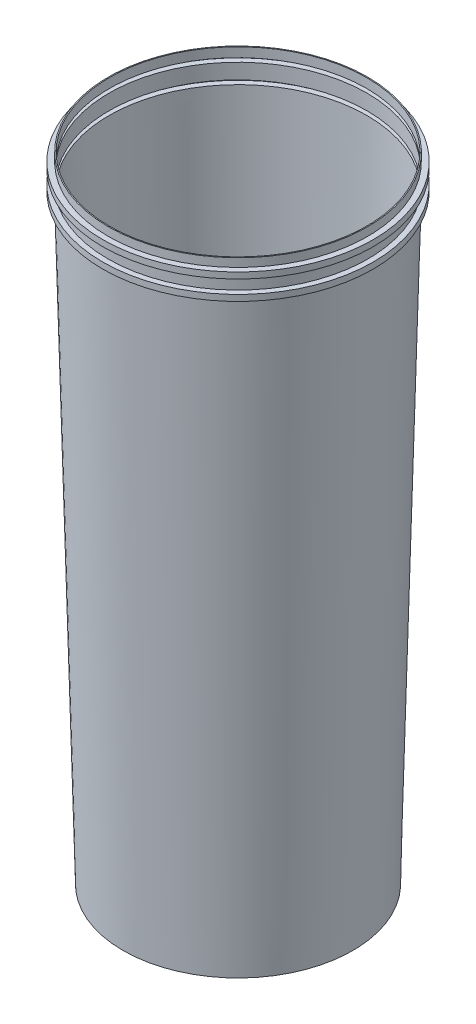
ISO-10303-21;
HEADER;
FILE_DESCRIPTION(('STEP AP214'),'2;1');
FILE_NAME('part.step','',(''),(''),'','','');
FILE_SCHEMA(('AUTOMOTIVE_DESIGN { 1 0 10303 214 1 1 1 1 }'));
ENDSEC;
DATA;
#1=APPLICATION_CONTEXT('core data for automotive mechanical design processes');
#2=APPLICATION_PROTOCOL_DEFINITION('international standard','automotive_design',2000,#1);
#3=PRODUCT_CONTEXT('',#1,'mechanical');
#4=PRODUCT('Part','Part','',(#3));
#5=PRODUCT_RELATED_PRODUCT_CATEGORY('part','',(#4));
#6=PRODUCT_DEFINITION_FORMATION('','',#4);
#7=PRODUCT_DEFINITION_CONTEXT('part definition',#1,'design');
#8=PRODUCT_DEFINITION('design','',#6,#7);
#9=PRODUCT_DEFINITION_SHAPE('','',#8);
#10=(LENGTH_UNIT() NAMED_UNIT(*) SI_UNIT(.MILLI.,.METRE.));
#11=(NAMED_UNIT(*) PLANE_ANGLE_UNIT() SI_UNIT($,.RADIAN.));
#12=(NAMED_UNIT(*) SI_UNIT($,.STERADIAN.) SOLID_ANGLE_UNIT());
#13=UNCERTAINTY_MEASURE_WITH_UNIT(LENGTH_MEASURE(1.E-05),#10,'distance_accuracy_value','');
#14=(GEOMETRIC_REPRESENTATION_CONTEXT(3) GLOBAL_UNCERTAINTY_ASSIGNED_CONTEXT((#13)) GLOBAL_UNIT_ASSIGNED_CONTEXT((#10,
#11,#12)) REPRESENTATION_CONTEXT('',''));
#15=CARTESIAN_POINT('',(0.,0.,0.));
#16=DIRECTION('',(0.,0.,1.));
#17=DIRECTION('',(1.,0.,0.));
#18=AXIS2_PLACEMENT_3D('',#15,#16,#17);
#19=CARTESIAN_POINT('',(0.,620.,0.));
#20=DIRECTION('',(0.,-1.,0.));
#21=DIRECTION('',(0.,0.,-1.));
#22=AXIS2_PLACEMENT_3D('',#19,#20,#21);
#23=PLANE('',#22);
#24=CARTESIAN_POINT('',(0.,620.,0.));
#25=DIRECTION('',(0.,-1.,0.));
#26=DIRECTION('',(0.,0.,-1.));
#27=AXIS2_PLACEMENT_3D('',#24,#25,#26);
#28=CIRCLE('',#27,126.);
#29=CARTESIAN_POINT('',(0.,620.,-126.));
#30=VERTEX_POINT('',#29);
#31=EDGE_CURVE('E93',#30,#30,#28,.T.);
#32=ORIENTED_EDGE('',*,*,#31,.T.);
#33=EDGE_LOOP('',(#32));
#34=FACE_BOUND('',#33,.T.);
#35=CARTESIAN_POINT('',(0.,620.,0.));
#36=DIRECTION('',(0.,-1.,0.));
#37=DIRECTION('',(0.,0.,-1.));
#38=AXIS2_PLACEMENT_3D('',#35,#36,#37);
#39=CIRCLE('',#38,127.);
#40=CARTESIAN_POINT('',(0.,620.,-127.));
#41=VERTEX_POINT('',#40);
#42=EDGE_CURVE('E11',#41,#41,#39,.T.);
#43=ORIENTED_EDGE('',*,*,#42,.F.);
#44=EDGE_LOOP('',(#43));
#45=FACE_BOUND('',#44,.T.);
#46=ADVANCED_FACE('F74',(#34,#45),#23,.F.);
#47=CARTESIAN_POINT('',(0.,0.,0.));
#48=DIRECTION('',(0.,-1.,0.));
#49=DIRECTION('',(0.,0.,-1.));
#50=AXIS2_PLACEMENT_3D('',#47,#48,#49);
#51=CYLINDRICAL_SURFACE('',#50,127.);
#52=CARTESIAN_POINT('',(0.,611.763571770545,0.));
#53=DIRECTION('',(0.,-1.,0.));
#54=DIRECTION('',(0.,0.,-1.));
#55=AXIS2_PLACEMENT_3D('',#52,#53,#54);
#56=CIRCLE('',#55,127.);
#57=CARTESIAN_POINT('',(0.,611.763571770545,-127.));
#58=VERTEX_POINT('',#57);
#59=EDGE_CURVE('E81',#58,#58,#56,.T.);
#60=ORIENTED_EDGE('',*,*,#59,.F.);
#61=EDGE_LOOP('',(#60));
#62=FACE_BOUND('',#61,.T.);
#63=ORIENTED_EDGE('',*,*,#42,.T.);
#64=EDGE_LOOP('',(#63));
#65=FACE_BOUND('',#64,.T.);
#66=ADVANCED_FACE('F180',(#62,#65),#51,.T.);
#67=CARTESIAN_POINT('',(-126.,611.763571770545,0.));
#68=DIRECTION('',(0.,-1.,0.));
#69=DIRECTION('',(0.,0.,-1.));
#70=AXIS2_PLACEMENT_3D('',#67,#68,#69);
#71=PLANE('',#70);
#72=CARTESIAN_POINT('',(0.,611.763571770545,0.));
#73=DIRECTION('',(0.,-1.,0.));
#74=DIRECTION('',(0.,0.,-1.));
#75=AXIS2_PLACEMENT_3D('',#72,#73,#74);
#76=CIRCLE('',#75,132.422468228301);
#77=CARTESIAN_POINT('',(0.,611.763571770545,-132.422468228301));
#78=VERTEX_POINT('',#77);
#79=EDGE_CURVE('E85',#78,#78,#76,.T.);
#80=ORIENTED_EDGE('',*,*,#79,.F.);
#81=EDGE_LOOP('',(#80));
#82=FACE_BOUND('',#81,.T.);
#83=ORIENTED_EDGE('',*,*,#59,.T.);
#84=EDGE_LOOP('',(#83));
#85=FACE_BOUND('',#84,.T.);
#86=ADVANCED_FACE('F185',(#82,#85),#71,.F.);
#87=CARTESIAN_POINT('',(0.,0.,0.));
#88=DIRECTION('',(0.,-1.,0.));
#89=DIRECTION('',(0.,0.,-1.));
#90=AXIS2_PLACEMENT_3D('',#87,#88,#89);
#91=CYLINDRICAL_SURFACE('',#90,132.422468228301);
#92=CARTESIAN_POINT('',(0.,605.763571770545,0.));
#93=DIRECTION('',(0.,1.,0.));
#94=DIRECTION('',(0.,0.,1.));
#95=AXIS2_PLACEMENT_3D('',#92,#93,#94);
#96=CIRCLE('',#95,132.422468228301);
#97=CARTESIAN_POINT('',(0.,605.763571770545,132.422468228301));
#98=VERTEX_POINT('',#97);
#99=EDGE_CURVE('E90',#98,#98,#96,.F.);
#100=ORIENTED_EDGE('',*,*,#99,.F.);
#101=EDGE_LOOP('',(#100));
#102=FACE_BOUND('',#101,.T.);
#103=ORIENTED_EDGE('',*,*,#79,.T.);
#104=EDGE_LOOP('',(#103));
#105=FACE_BOUND('',#104,.T.);
#106=ADVANCED_FACE('F195',(#102,#105),#91,.T.);
#107=CARTESIAN_POINT('',(-131.422468228301,605.763571770545,0.));
#108=DIRECTION('',(0.,1.,0.));
#109=DIRECTION('',(0.,0.,1.));
#110=AXIS2_PLACEMENT_3D('',#107,#108,#109);
#111=PLANE('',#110);
#112=CARTESIAN_POINT('',(0.,605.763571770545,0.));
#113=DIRECTION('',(0.,1.,0.));
#114=DIRECTION('',(0.,0.,1.));
#115=AXIS2_PLACEMENT_3D('',#112,#113,#114);
#116=CIRCLE('',#115,127.257555315517);
#117=CARTESIAN_POINT('',(0.,605.763571770545,127.257555315517));
#118=VERTEX_POINT('',#117);
#119=EDGE_CURVE('E98',#118,#118,#116,.F.);
#120=ORIENTED_EDGE('',*,*,#119,.F.);
#121=EDGE_LOOP('',(#120));
#122=FACE_BOUND('',#121,.T.);
#123=ORIENTED_EDGE('',*,*,#99,.T.);
#124=EDGE_LOOP('',(#123));
#125=FACE_BOUND('',#124,.T.);
#126=ADVANCED_FACE('F199',(#122,#125),#111,.F.);
#127=CARTESIAN_POINT('',(0.,0.,0.));
#128=DIRECTION('',(0.,-1.,0.));
#129=DIRECTION('',(0.,0.,-1.));
#130=AXIS2_PLACEMENT_3D('',#127,#128,#129);
#131=CYLINDRICAL_SURFACE('',#130,127.257555315517);
#132=CARTESIAN_POINT('',(0.,592.763571770545,0.));
#133=DIRECTION('',(0.,-1.,0.));
#134=DIRECTION('',(0.,0.,-1.));
#135=AXIS2_PLACEMENT_3D('',#132,#133,#134);
#136=CIRCLE('',#135,127.257555315517);
#137=CARTESIAN_POINT('',(0.,592.763571770545,-127.257555315517));
#138=VERTEX_POINT('',#137);
#139=EDGE_CURVE('E101',#138,#138,#136,.T.);
#140=ORIENTED_EDGE('',*,*,#139,.F.);
#141=EDGE_LOOP('',(#140));
#142=FACE_BOUND('',#141,.T.);
#143=ORIENTED_EDGE('',*,*,#119,.T.);
#144=EDGE_LOOP('',(#143));
#145=FACE_BOUND('',#144,.T.);
#146=ADVANCED_FACE('F203',(#142,#145),#131,.T.);
#147=CARTESIAN_POINT('',(-126.257555315517,592.763571770545,0.));
#148=DIRECTION('',(0.,-1.,0.));
#149=DIRECTION('',(0.,0.,-1.));
#150=AXIS2_PLACEMENT_3D('',#147,#148,#149);
#151=PLANE('',#150);
#152=CARTESIAN_POINT('',(0.,592.763571770545,0.));
#153=DIRECTION('',(0.,-1.,0.));
#154=DIRECTION('',(0.,0.,-1.));
#155=AXIS2_PLACEMENT_3D('',#152,#153,#154);
#156=CIRCLE('',#155,132.422468228301);
#157=CARTESIAN_POINT('',(0.,592.763571770545,-132.422468228301));
#158=VERTEX_POINT('',#157);
#159=EDGE_CURVE('E104',#158,#158,#156,.T.);
#160=ORIENTED_EDGE('',*,*,#159,.F.);
#161=EDGE_LOOP('',(#160));
#162=FACE_BOUND('',#161,.T.);
#163=ORIENTED_EDGE('',*,*,#139,.T.);
#164=EDGE_LOOP('',(#163));
#165=FACE_BOUND('',#164,.T.);
#166=ADVANCED_FACE('F207',(#162,#165),#151,.F.);
#167=CARTESIAN_POINT('',(0.,0.,0.));
#168=DIRECTION('',(0.,-1.,0.));
#169=DIRECTION('',(0.,0.,-1.));
#170=AXIS2_PLACEMENT_3D('',#167,#168,#169);
#171=CYLINDRICAL_SURFACE('',#170,132.422468228301);
#172=CARTESIAN_POINT('',(0.,586.763571770545,0.));
#173=DIRECTION('',(0.,1.,0.));
#174=DIRECTION('',(0.,0.,1.));
#175=AXIS2_PLACEMENT_3D('',#172,#173,#174);
#176=CIRCLE('',#175,132.422468228301);
#177=CARTESIAN_POINT('',(0.,586.763571770545,132.422468228301));
#178=VERTEX_POINT('',#177);
#179=EDGE_CURVE('E107',#178,#178,#176,.F.);
#180=ORIENTED_EDGE('',*,*,#179,.F.);
#181=EDGE_LOOP('',(#180));
#182=FACE_BOUND('',#181,.T.);
#183=ORIENTED_EDGE('',*,*,#159,.T.);
#184=EDGE_LOOP('',(#183));
#185=FACE_BOUND('',#184,.T.);
#186=ADVANCED_FACE('F211',(#182,#185),#171,.T.);
#187=CARTESIAN_POINT('',(-131.422468228301,586.763571770545,0.));
#188=DIRECTION('',(0.,1.,0.));
#189=DIRECTION('',(0.,0.,1.));
#190=AXIS2_PLACEMENT_3D('',#187,#188,#189);
#191=PLANE('',#190);
#192=CARTESIAN_POINT('',(0.,586.763571770545,0.));
#193=DIRECTION('',(0.,1.,0.));
#194=DIRECTION('',(0.,0.,1.));
#195=AXIS2_PLACEMENT_3D('',#192,#193,#194);
#196=CIRCLE('',#195,127.232944835723);
#197=CARTESIAN_POINT('',(0.,586.763571770545,127.232944835723));
#198=VERTEX_POINT('',#197);
#199=EDGE_CURVE('E110',#198,#198,#196,.F.);
#200=ORIENTED_EDGE('',*,*,#199,.F.);
#201=EDGE_LOOP('',(#200));
#202=FACE_BOUND('',#201,.T.);
#203=ORIENTED_EDGE('',*,*,#179,.T.);
#204=EDGE_LOOP('',(#203));
#205=FACE_BOUND('',#204,.T.);
#206=ADVANCED_FACE('F215',(#202,#205),#191,.F.);
#207=CARTESIAN_POINT('',(0.,587.738658546889,0.));
#208=DIRECTION('',(0.,1.,0.));
#209=DIRECTION('',(0.,0.,1.));
#210=AXIS2_PLACEMENT_3D('',#207,#208,#209);
#211=CONICAL_SURFACE('',#210,127.257244932992,0.0249158015189749);
#212=CARTESIAN_POINT('',(0.,-1.,0.));
#213=DIRECTION('',(0.,1.,0.));
#214=DIRECTION('',(0.,0.,1.));
#215=AXIS2_PLACEMENT_3D('',#212,#213,#214);
#216=CIRCLE('',#215,112.585313146541);
#217=CARTESIAN_POINT('',(0.,-1.,112.585313146541));
#218=VERTEX_POINT('',#217);
#219=EDGE_CURVE('E112',#218,#218,#216,.F.);
#220=ORIENTED_EDGE('',*,*,#219,.F.);
#221=EDGE_LOOP('',(#220));
#222=FACE_BOUND('',#221,.T.);
#223=ORIENTED_EDGE('',*,*,#199,.T.);
#224=EDGE_LOOP('',(#223));
#225=FACE_BOUND('',#224,.T.);
#226=ADVANCED_FACE('F218',(#222,#225),#211,.T.);
#227=CARTESIAN_POINT('',(-111.609923626335,-1.,0.));
#228=DIRECTION('',(0.,1.,0.));
#229=DIRECTION('',(0.,0.,1.));
#230=AXIS2_PLACEMENT_3D('',#227,#228,#229);
#231=PLANE('',#230);
#232=ORIENTED_EDGE('',*,*,#219,.T.);
#233=EDGE_LOOP('',(#232));
#234=FACE_BOUND('',#233,.T.);
#235=ADVANCED_FACE('F76',(#234),#231,.F.);
#236=CARTESIAN_POINT('',(0.,0.,0.));
#237=DIRECTION('',(0.,-1.,0.));
#238=DIRECTION('',(0.,0.,-1.));
#239=AXIS2_PLACEMENT_3D('',#236,#237,#238);
#240=CYLINDRICAL_SURFACE('',#239,126.);
#241=CARTESIAN_POINT('',(0.,610.763571770545,0.));
#242=DIRECTION('',(0.,-1.,0.));
#243=DIRECTION('',(0.,0.,-1.));
#244=AXIS2_PLACEMENT_3D('',#241,#242,#243);
#245=CIRCLE('',#244,126.);
#246=CARTESIAN_POINT('',(0.,610.763571770545,-126.));
#247=VERTEX_POINT('',#246);
#248=EDGE_CURVE('E117',#247,#247,#245,.T.);
#249=ORIENTED_EDGE('',*,*,#248,.T.);
#250=EDGE_LOOP('',(#249));
#251=FACE_BOUND('',#250,.T.);
#252=ORIENTED_EDGE('',*,*,#31,.F.);
#253=EDGE_LOOP('',(#252));
#254=FACE_BOUND('',#253,.T.);
#255=ADVANCED_FACE('F190',(#251,#254),#240,.F.);
#256=CARTESIAN_POINT('',(-126.,610.763571770545,0.));
#257=DIRECTION('',(0.,-1.,0.));
#258=DIRECTION('',(0.,0.,-1.));
#259=AXIS2_PLACEMENT_3D('',#256,#257,#258);
#260=PLANE('',#259);
#261=CARTESIAN_POINT('',(0.,610.763571770545,0.));
#262=DIRECTION('',(0.,-1.,0.));
#263=DIRECTION('',(0.,0.,-1.));
#264=AXIS2_PLACEMENT_3D('',#261,#262,#263);
#265=CIRCLE('',#264,131.422468228301);
#266=CARTESIAN_POINT('',(0.,610.763571770545,-131.422468228301));
#267=VERTEX_POINT('',#266);
#268=EDGE_CURVE('E121',#267,#267,#265,.T.);
#269=ORIENTED_EDGE('',*,*,#268,.T.);
#270=EDGE_LOOP('',(#269));
#271=FACE_BOUND('',#270,.T.);
#272=ORIENTED_EDGE('',*,*,#248,.F.);
#273=EDGE_LOOP('',(#272));
#274=FACE_BOUND('',#273,.T.);
#275=ADVANCED_FACE('F242',(#271,#274),#260,.T.);
#276=CARTESIAN_POINT('',(0.,0.,0.));
#277=DIRECTION('',(0.,-1.,0.));
#278=DIRECTION('',(0.,0.,-1.));
#279=AXIS2_PLACEMENT_3D('',#276,#277,#278);
#280=CYLINDRICAL_SURFACE('',#279,131.422468228301);
#281=CARTESIAN_POINT('',(0.,606.763571770545,0.));
#282=DIRECTION('',(0.,-1.,0.));
#283=DIRECTION('',(0.,0.,-1.));
#284=AXIS2_PLACEMENT_3D('',#281,#282,#283);
#285=CIRCLE('',#284,131.422468228301);
#286=CARTESIAN_POINT('',(0.,606.763571770545,-131.422468228301));
#287=VERTEX_POINT('',#286);
#288=EDGE_CURVE('E125',#287,#287,#285,.T.);
#289=ORIENTED_EDGE('',*,*,#288,.T.);
#290=EDGE_LOOP('',(#289));
#291=FACE_BOUND('',#290,.T.);
#292=ORIENTED_EDGE('',*,*,#268,.F.);
#293=EDGE_LOOP('',(#292));
#294=FACE_BOUND('',#293,.T.);
#295=ADVANCED_FACE('F246',(#291,#294),#280,.F.);
#296=CARTESIAN_POINT('',(-131.422468228301,606.763571770545,0.));
#297=DIRECTION('',(0.,1.,0.));
#298=DIRECTION('',(0.,0.,1.));
#299=AXIS2_PLACEMENT_3D('',#296,#297,#298);
#300=PLANE('',#299);
#301=CARTESIAN_POINT('',(0.,606.763571770545,0.));
#302=DIRECTION('',(0.,-1.,0.));
#303=DIRECTION('',(0.,0.,-1.));
#304=AXIS2_PLACEMENT_3D('',#301,#302,#303);
#305=CIRCLE('',#304,126.257555315517);
#306=CARTESIAN_POINT('',(0.,606.763571770545,-126.257555315517));
#307=VERTEX_POINT('',#306);
#308=EDGE_CURVE('E130',#307,#307,#305,.T.);
#309=ORIENTED_EDGE('',*,*,#308,.T.);
#310=EDGE_LOOP('',(#309));
#311=FACE_BOUND('',#310,.T.);
#312=ORIENTED_EDGE('',*,*,#288,.F.);
#313=EDGE_LOOP('',(#312));
#314=FACE_BOUND('',#313,.T.);
#315=ADVANCED_FACE('F252',(#311,#314),#300,.T.);
#316=CARTESIAN_POINT('',(0.,0.,0.));
#317=DIRECTION('',(0.,-1.,0.));
#318=DIRECTION('',(0.,0.,-1.));
#319=AXIS2_PLACEMENT_3D('',#316,#317,#318);
#320=CYLINDRICAL_SURFACE('',#319,126.257555315517);
#321=CARTESIAN_POINT('',(0.,591.763571770545,0.));
#322=DIRECTION('',(0.,-1.,0.));
#323=DIRECTION('',(0.,0.,-1.));
#324=AXIS2_PLACEMENT_3D('',#321,#322,#323);
#325=CIRCLE('',#324,126.257555315517);
#326=CARTESIAN_POINT('',(0.,591.763571770545,-126.257555315517));
#327=VERTEX_POINT('',#326);
#328=EDGE_CURVE('E133',#327,#327,#325,.T.);
#329=ORIENTED_EDGE('',*,*,#328,.T.);
#330=EDGE_LOOP('',(#329));
#331=FACE_BOUND('',#330,.T.);
#332=ORIENTED_EDGE('',*,*,#308,.F.);
#333=EDGE_LOOP('',(#332));
#334=FACE_BOUND('',#333,.T.);
#335=ADVANCED_FACE('F259',(#331,#334),#320,.F.);
#336=CARTESIAN_POINT('',(-126.257555315517,591.763571770545,0.));
#337=DIRECTION('',(0.,-1.,0.));
#338=DIRECTION('',(0.,0.,-1.));
#339=AXIS2_PLACEMENT_3D('',#336,#337,#338);
#340=PLANE('',#339);
#341=CARTESIAN_POINT('',(0.,591.763571770545,0.));
#342=DIRECTION('',(0.,-1.,0.));
#343=DIRECTION('',(0.,0.,-1.));
#344=AXIS2_PLACEMENT_3D('',#341,#342,#343);
#345=CIRCLE('',#344,131.422468228301);
#346=CARTESIAN_POINT('',(0.,591.763571770545,-131.422468228301));
#347=VERTEX_POINT('',#346);
#348=EDGE_CURVE('E136',#347,#347,#345,.T.);
#349=ORIENTED_EDGE('',*,*,#348,.T.);
#350=EDGE_LOOP('',(#349));
#351=FACE_BOUND('',#350,.T.);
#352=ORIENTED_EDGE('',*,*,#328,.F.);
#353=EDGE_LOOP('',(#352));
#354=FACE_BOUND('',#353,.T.);
#355=ADVANCED_FACE('F263',(#351,#354),#340,.T.);
#356=CARTESIAN_POINT('',(0.,0.,0.));
#357=DIRECTION('',(0.,-1.,0.));
#358=DIRECTION('',(0.,0.,-1.));
#359=AXIS2_PLACEMENT_3D('',#356,#357,#358);
#360=CYLINDRICAL_SURFACE('',#359,131.422468228301);
#361=CARTESIAN_POINT('',(0.,587.763571770545,0.));
#362=DIRECTION('',(0.,-1.,0.));
#363=DIRECTION('',(0.,0.,-1.));
#364=AXIS2_PLACEMENT_3D('',#361,#362,#363);
#365=CIRCLE('',#364,131.422468228301);
#366=CARTESIAN_POINT('',(0.,587.763571770545,-131.422468228301));
#367=VERTEX_POINT('',#366);
#368=EDGE_CURVE('E139',#367,#367,#365,.T.);
#369=ORIENTED_EDGE('',*,*,#368,.T.);
#370=EDGE_LOOP('',(#369));
#371=FACE_BOUND('',#370,.T.);
#372=ORIENTED_EDGE('',*,*,#348,.F.);
#373=EDGE_LOOP('',(#372));
#374=FACE_BOUND('',#373,.T.);
#375=ADVANCED_FACE('F267',(#371,#374),#360,.F.);
#376=CARTESIAN_POINT('',(-131.422468228301,587.763571770545,0.));
#377=DIRECTION('',(0.,1.,0.));
#378=DIRECTION('',(0.,0.,1.));
#379=AXIS2_PLACEMENT_3D('',#376,#377,#378);
#380=PLANE('',#379);
#381=CARTESIAN_POINT('',(0.,587.763571770545,0.));
#382=DIRECTION('',(0.,-1.,0.));
#383=DIRECTION('',(0.,0.,-1.));
#384=AXIS2_PLACEMENT_3D('',#381,#382,#383);
#385=CIRCLE('',#384,126.257555315517);
#386=CARTESIAN_POINT('',(0.,587.763571770545,-126.257555315517));
#387=VERTEX_POINT('',#386);
#388=EDGE_CURVE('E142',#387,#387,#385,.T.);
#389=ORIENTED_EDGE('',*,*,#388,.T.);
#390=EDGE_LOOP('',(#389));
#391=FACE_BOUND('',#390,.T.);
#392=ORIENTED_EDGE('',*,*,#368,.F.);
#393=EDGE_LOOP('',(#392));
#394=FACE_BOUND('',#393,.T.);
#395=ADVANCED_FACE('F271',(#391,#394),#380,.T.);
#396=CARTESIAN_POINT('',(0.,587.763571770545,0.));
#397=DIRECTION('',(0.,1.,0.));
#398=DIRECTION('',(0.,0.,1.));
#399=AXIS2_PLACEMENT_3D('',#396,#397,#398);
#400=CONICAL_SURFACE('',#399,126.257555315517,0.0249158015189749);
#401=CARTESIAN_POINT('',(0.,0.,0.));
#402=DIRECTION('',(0.,-1.,0.));
#403=DIRECTION('',(0.,0.,-1.));
#404=AXIS2_PLACEMENT_3D('',#401,#402,#403);
#405=CIRCLE('',#404,111.609923626335);
#406=CARTESIAN_POINT('',(0.,0.,-111.609923626335));
#407=VERTEX_POINT('',#406);
#408=EDGE_CURVE('E145',#407,#407,#405,.T.);
#409=ORIENTED_EDGE('',*,*,#408,.T.);
#410=EDGE_LOOP('',(#409));
#411=FACE_BOUND('',#410,.T.);
#412=ORIENTED_EDGE('',*,*,#388,.F.);
#413=EDGE_LOOP('',(#412));
#414=FACE_BOUND('',#413,.T.);
#415=ADVANCED_FACE('F275',(#411,#414),#400,.F.);
#416=CARTESIAN_POINT('',(-111.609923626335,0.,0.));
#417=DIRECTION('',(0.,1.,0.));
#418=DIRECTION('',(0.,0.,1.));
#419=AXIS2_PLACEMENT_3D('',#416,#417,#418);
#420=PLANE('',#419);
#421=CARTESIAN_POINT('',(-14.9998207131204,0.,0.));
#422=DIRECTION('',(0.,-1.,0.));
#423=DIRECTION('',(0.,0.,1.));
#424=AXIS2_PLACEMENT_3D('',#421,#422,#423);
#425=CIRCLE('',#424,2.5);
#426=CARTESIAN_POINT('',(-14.9998207131204,0.,2.5));
#427=VERTEX_POINT('',#426);
#428=EDGE_CURVE('E157',#427,#427,#425,.T.);
#429=ORIENTED_EDGE('',*,*,#428,.T.);
#430=EDGE_LOOP('',(#429));
#431=FACE_BOUND('',#430,.T.);
#432=ORIENTED_EDGE('',*,*,#408,.F.);
#433=EDGE_LOOP('',(#432));
#434=FACE_BOUND('',#433,.T.);
#435=ADVANCED_FACE('F161',(#431,#434),#420,.T.);
#436=CARTESIAN_POINT('',(14.9998207131203,0.0733387635966087,0.));
#437=DIRECTION('',(0.,1.,0.));
#438=DIRECTION('',(0.,0.,1.));
#439=AXIS2_PLACEMENT_3D('',#436,#437,#438);
#440=PLANE('',#439);
#441=CARTESIAN_POINT('',(14.9998207131203,0.0733387635966087,0.));
#442=DIRECTION('',(0.,1.,0.));
#443=DIRECTION('',(0.,0.,1.));
#444=AXIS2_PLACEMENT_3D('',#441,#442,#443);
#445=CIRCLE('',#444,2.5);
#446=CARTESIAN_POINT('',(14.9998207131203,0.0733387635966087,2.5));
#447=VERTEX_POINT('',#446);
#448=EDGE_CURVE('E148',#447,#447,#445,.T.);
#449=ORIENTED_EDGE('',*,*,#448,.F.);
#450=EDGE_LOOP('',(#449));
#451=FACE_BOUND('',#450,.T.);
#452=ADVANCED_FACE('F167',(#451),#440,.F.);
#453=CARTESIAN_POINT('',(-14.9998207131204,0.,0.));
#454=DIRECTION('',(0.,1.,0.));
#455=DIRECTION('',(-1.,0.,0.));
#456=AXIS2_PLACEMENT_3D('',#453,#454,#455);
#457=CYLINDRICAL_SURFACE('',#456,2.5);
#458=CARTESIAN_POINT('',(-14.9998207131203,280.073518050476,0.));
#459=DIRECTION('',(0.,-1.,0.));
#460=DIRECTION('',(0.,0.,1.));
#461=AXIS2_PLACEMENT_3D('',#458,#459,#460);
#462=CIRCLE('',#461,2.5);
#463=CARTESIAN_POINT('',(-17.4998207131203,280.073518050476,0.));
#464=VERTEX_POINT('',#463);
#465=EDGE_CURVE('E154',#464,#464,#462,.T.);
#466=ORIENTED_EDGE('',*,*,#465,.T.);
#467=EDGE_LOOP('',(#466));
#468=FACE_BOUND('',#467,.T.);
#469=ORIENTED_EDGE('',*,*,#428,.F.);
#470=EDGE_LOOP('',(#469));
#471=FACE_BOUND('',#470,.T.);
#472=ADVANCED_FACE('F164',(#468,#471),#457,.T.);
#473=CARTESIAN_POINT('',(0.,280.073518050476,0.));
#474=DIRECTION('',(0.,0.,-1.));
#475=DIRECTION('',(-1.,0.,0.));
#476=AXIS2_PLACEMENT_3D('',#473,#474,#475);
#477=TOROIDAL_SURFACE('',#476,14.9998207131203,2.5);
#478=CARTESIAN_POINT('',(14.9998207131203,280.073518050476,0.));
#479=DIRECTION('',(0.,1.,0.));
#480=DIRECTION('',(0.,0.,1.));
#481=AXIS2_PLACEMENT_3D('',#478,#479,#480);
#482=CIRCLE('',#481,2.5);
#483=CARTESIAN_POINT('',(17.4998207131203,280.073518050476,0.));
#484=VERTEX_POINT('',#483);
#485=EDGE_CURVE('E151',#484,#484,#482,.T.);
#486=CARTESIAN_POINT('',(0.,280.073518050476,0.));
#487=DIRECTION('',(0.,0.,-1.));
#488=DIRECTION('',(-1.,0.,0.));
#489=AXIS2_PLACEMENT_3D('',#486,#487,#488);
#490=CIRCLE('',#489,17.4998207131203);
#491=EDGE_CURVE('',#464,#484,#490,.T.);
#492=ORIENTED_EDGE('',*,*,#465,.F.);
#493=ORIENTED_EDGE('',*,*,#485,.T.);
#494=ORIENTED_EDGE('',*,*,#491,.T.);
#495=ORIENTED_EDGE('',*,*,#491,.F.);
#496=EDGE_LOOP('',(#492,#494,#493,#495));
#497=FACE_BOUND('',#496,.T.);
#498=ADVANCED_FACE('F166',(#497),#477,.T.);
#499=CARTESIAN_POINT('',(14.9998207131203,280.073518050476,0.));
#500=DIRECTION('',(0.,-1.,0.));
#501=DIRECTION('',(0.,0.,-1.));
#502=AXIS2_PLACEMENT_3D('',#499,#500,#501);
#503=CYLINDRICAL_SURFACE('',#502,2.5);
#504=ORIENTED_EDGE('',*,*,#448,.T.);
#505=EDGE_LOOP('',(#504));
#506=FACE_BOUND('',#505,.T.);
#507=ORIENTED_EDGE('',*,*,#485,.F.);
#508=EDGE_LOOP('',(#507));
#509=FACE_BOUND('',#508,.T.);
#510=ADVANCED_FACE('F174',(#506,#509),#503,.T.);
#511=CLOSED_SHELL('',(#46,#66,#86,#106,#126,#146,#166,#186,#206,#226,#235,#255,#275,#295,#315,
#335,#355,#375,#395,#415,#435,#452,#472,#498,#510));
#512=MANIFOLD_SOLID_BREP('B2',#511);
#513=ADVANCED_BREP_SHAPE_REPRESENTATION('',(#18,#512),#14);
#514=SHAPE_DEFINITION_REPRESENTATION(#9,#513);
ENDSEC;
END-ISO-10303-21;
